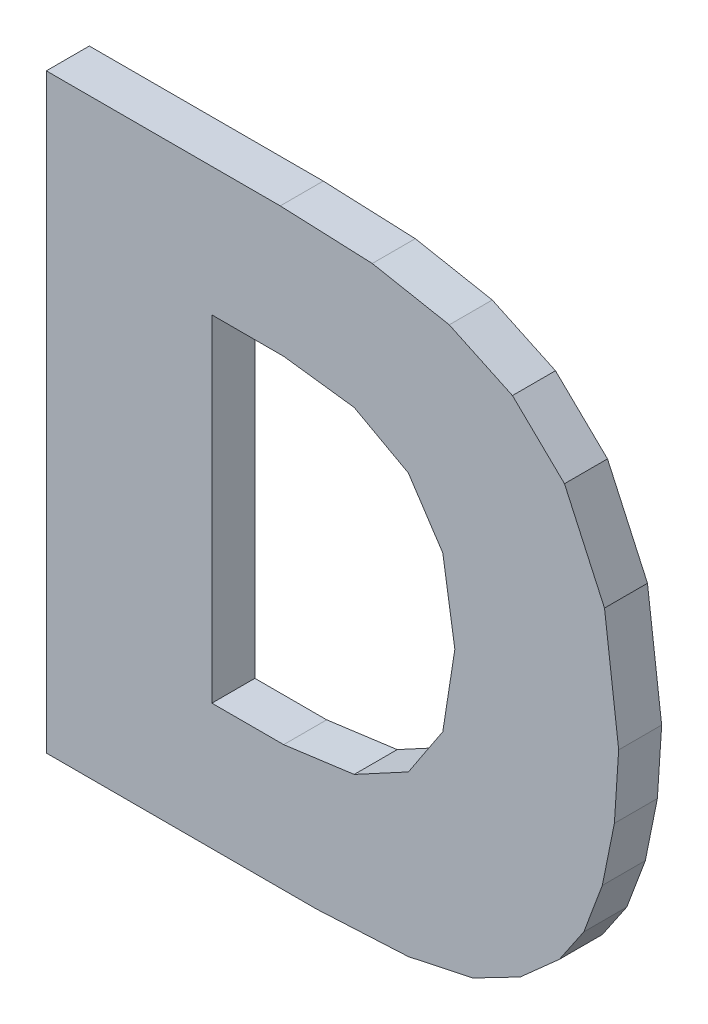
ISO-10303-21;
HEADER;
FILE_DESCRIPTION(('STEP AP214'),'2;1');
FILE_NAME('part.step','',(''),(''),'','','');
FILE_SCHEMA(('AUTOMOTIVE_DESIGN { 1 0 10303 214 1 1 1 1 }'));
ENDSEC;
DATA;
#1=APPLICATION_CONTEXT('core data for automotive mechanical design processes');
#2=APPLICATION_PROTOCOL_DEFINITION('international standard','automotive_design',2000,#1);
#3=PRODUCT_CONTEXT('',#1,'mechanical');
#4=PRODUCT('Part','Part','',(#3));
#5=PRODUCT_RELATED_PRODUCT_CATEGORY('part','',(#4));
#6=PRODUCT_DEFINITION_FORMATION('','',#4);
#7=PRODUCT_DEFINITION_CONTEXT('part definition',#1,'design');
#8=PRODUCT_DEFINITION('design','',#6,#7);
#9=PRODUCT_DEFINITION_SHAPE('','',#8);
#10=(LENGTH_UNIT() NAMED_UNIT(*) SI_UNIT(.MILLI.,.METRE.));
#11=(NAMED_UNIT(*) PLANE_ANGLE_UNIT() SI_UNIT($,.RADIAN.));
#12=(NAMED_UNIT(*) SI_UNIT($,.STERADIAN.) SOLID_ANGLE_UNIT());
#13=UNCERTAINTY_MEASURE_WITH_UNIT(LENGTH_MEASURE(1.E-05),#10,'distance_accuracy_value','');
#14=(GEOMETRIC_REPRESENTATION_CONTEXT(3) GLOBAL_UNCERTAINTY_ASSIGNED_CONTEXT((#13)) GLOBAL_UNIT_ASSIGNED_CONTEXT((#10,
#11,#12)) REPRESENTATION_CONTEXT('',''));
#15=CARTESIAN_POINT('',(0.,0.,0.));
#16=DIRECTION('',(0.,0.,1.));
#17=DIRECTION('',(1.,0.,0.));
#18=AXIS2_PLACEMENT_3D('',#15,#16,#17);
#19=CARTESIAN_POINT('',(0.,0.,0.));
#20=DIRECTION('',(0.,0.,1.));
#21=DIRECTION('',(1.,0.,0.));
#22=AXIS2_PLACEMENT_3D('',#19,#20,#21);
#23=PLANE('',#22);
#24=DIRECTION('',(1.,0.,0.));
#25=VECTOR('',#24,1.);
#26=CARTESIAN_POINT('',(0.311,-1.737,0.));
#27=LINE('',#26,#25);
#28=CARTESIAN_POINT('',(0.311,-1.737,0.));
#29=VERTEX_POINT('',#28);
#30=CARTESIAN_POINT('',(0.477999999999999,-1.737,0.));
#31=VERTEX_POINT('',#30);
#32=EDGE_CURVE('E336',#29,#31,#27,.T.);
#33=ORIENTED_EDGE('',*,*,#32,.F.);
#34=DIRECTION('',(0.,1.,0.));
#35=VECTOR('',#34,1.);
#36=CARTESIAN_POINT('',(0.311,-2.519,0.));
#37=LINE('',#36,#35);
#38=CARTESIAN_POINT('',(0.311,-2.519,0.));
#39=VERTEX_POINT('',#38);
#40=EDGE_CURVE('E331',#39,#29,#37,.T.);
#41=ORIENTED_EDGE('',*,*,#40,.F.);
#42=DIRECTION('',(1.,0.,0.));
#43=VECTOR('',#42,1.);
#44=CARTESIAN_POINT('',(0.478,-2.519,0.));
#45=LINE('',#44,#43);
#46=CARTESIAN_POINT('',(0.478,-2.519,0.));
#47=VERTEX_POINT('',#46);
#48=EDGE_CURVE('E326',#47,#39,#45,.F.);
#49=ORIENTED_EDGE('',*,*,#48,.F.);
#50=DIRECTION('',(-0.99112202245936,-0.132955393256795,0.));
#51=VECTOR('',#50,1.);
#52=CARTESIAN_POINT('',(0.642,-2.497,0.));
#53=LINE('',#52,#51);
#54=CARTESIAN_POINT('',(0.641999999999999,-2.497,0.));
#55=VERTEX_POINT('',#54);
#56=EDGE_CURVE('E321',#55,#47,#53,.T.);
#57=ORIENTED_EDGE('',*,*,#56,.F.);
#58=DIRECTION('',(-0.880022172669681,-0.47493260112329,0.));
#59=VECTOR('',#58,1.);
#60=CARTESIAN_POINT('',(0.768,-2.429,0.));
#61=LINE('',#60,#59);
#62=CARTESIAN_POINT('',(0.768000000000001,-2.429,0.));
#63=VERTEX_POINT('',#62);
#64=EDGE_CURVE('E316',#63,#55,#61,.T.);
#65=ORIENTED_EDGE('',*,*,#64,.F.);
#66=DIRECTION('',(-0.551514326966389,-0.834165419536683,0.));
#67=VECTOR('',#66,1.);
#68=CARTESIAN_POINT('',(0.848,-2.308,0.));
#69=LINE('',#68,#67);
#70=CARTESIAN_POINT('',(0.847999999999998,-2.308,0.));
#71=VERTEX_POINT('',#70);
#72=EDGE_CURVE('E311',#71,#63,#69,.T.);
#73=ORIENTED_EDGE('',*,*,#72,.F.);
#74=DIRECTION('',(-0.153707006281897,-0.988116468954878,0.));
#75=VECTOR('',#74,1.);
#76=CARTESIAN_POINT('',(0.876,-2.128,0.));
#77=LINE('',#76,#75);
#78=CARTESIAN_POINT('',(0.876000000000002,-2.128,0.));
#79=VERTEX_POINT('',#78);
#80=EDGE_CURVE('E306',#79,#71,#77,.T.);
#81=ORIENTED_EDGE('',*,*,#80,.F.);
#82=DIRECTION('',(0.153707006281897,-0.988116468954878,0.));
#83=VECTOR('',#82,1.);
#84=CARTESIAN_POINT('',(0.848,-1.948,0.));
#85=LINE('',#84,#83);
#86=CARTESIAN_POINT('',(0.847999999999999,-1.948,0.));
#87=VERTEX_POINT('',#86);
#88=EDGE_CURVE('E301',#87,#79,#85,.T.);
#89=ORIENTED_EDGE('',*,*,#88,.F.);
#90=DIRECTION('',(0.551514326966389,-0.834165419536683,0.));
#91=VECTOR('',#90,1.);
#92=CARTESIAN_POINT('',(0.768,-1.827,0.));
#93=LINE('',#92,#91);
#94=CARTESIAN_POINT('',(0.768,-1.827,0.));
#95=VERTEX_POINT('',#94);
#96=EDGE_CURVE('E296',#95,#87,#93,.T.);
#97=ORIENTED_EDGE('',*,*,#96,.F.);
#98=DIRECTION('',(0.877096267841495,-0.480314622865597,0.));
#99=VECTOR('',#98,1.);
#100=CARTESIAN_POINT('',(0.642,-1.758,0.));
#101=LINE('',#100,#99);
#102=CARTESIAN_POINT('',(0.642,-1.758,0.));
#103=VERTEX_POINT('',#102);
#104=EDGE_CURVE('E347',#103,#95,#101,.T.);
#105=ORIENTED_EDGE('',*,*,#104,.F.);
#106=DIRECTION('',(0.991901213682567,-0.127011740776396,0.));
#107=VECTOR('',#106,1.);
#108=CARTESIAN_POINT('',(0.478,-1.737,0.));
#109=LINE('',#108,#107);
#110=EDGE_CURVE('E341',#31,#103,#109,.T.);
#111=ORIENTED_EDGE('',*,*,#110,.F.);
#112=EDGE_LOOP('',(#33,#41,#49,#57,#65,#73,#81,#89,#97,#105,#111));
#113=FACE_BOUND('',#112,.T.);
#114=DIRECTION('',(-0.905236944073012,0.424907137013906,0.));
#115=VECTOR('',#114,1.);
#116=CARTESIAN_POINT('',(1.01,-1.55,0.));
#117=LINE('',#116,#115);
#118=CARTESIAN_POINT('',(1.01,-1.55,0.));
#119=VERTEX_POINT('',#118);
#120=CARTESIAN_POINT('',(0.863000000000001,-1.481,0.));
#121=VERTEX_POINT('',#120);
#122=EDGE_CURVE('E283',#119,#121,#117,.T.);
#123=ORIENTED_EDGE('',*,*,#122,.F.);
#124=DIRECTION('',(-0.71888940505698,0.69512446604678,0.));
#125=VECTOR('',#124,1.);
#126=CARTESIAN_POINT('',(1.131,-1.667,0.));
#127=LINE('',#126,#125);
#128=CARTESIAN_POINT('',(1.131,-1.667,0.));
#129=VERTEX_POINT('',#128);
#130=EDGE_CURVE('E278',#129,#119,#127,.T.);
#131=ORIENTED_EDGE('',*,*,#130,.F.);
#132=DIRECTION('',(-0.414810847726089,0.909907665979776,0.));
#133=VECTOR('',#132,1.);
#134=CARTESIAN_POINT('',(1.224,-1.871,0.));
#135=LINE('',#134,#133);
#136=CARTESIAN_POINT('',(1.224,-1.871,0.));
#137=VERTEX_POINT('',#136);
#138=EDGE_CURVE('E273',#137,#129,#135,.T.);
#139=ORIENTED_EDGE('',*,*,#138,.F.);
#140=DIRECTION('',(-0.121763757027801,0.992559110317605,0.));
#141=VECTOR('',#140,1.);
#142=CARTESIAN_POINT('',(1.257,-2.14,0.));
#143=LINE('',#142,#141);
#144=CARTESIAN_POINT('',(1.257,-2.14,0.));
#145=VERTEX_POINT('',#144);
#146=EDGE_CURVE('E268',#145,#137,#143,.T.);
#147=ORIENTED_EDGE('',*,*,#146,.F.);
#148=DIRECTION('',(0.0652203195035123,0.997870888403835,0.));
#149=VECTOR('',#148,1.);
#150=CARTESIAN_POINT('',(1.247,-2.293,0.));
#151=LINE('',#150,#149);
#152=CARTESIAN_POINT('',(1.247,-2.293,0.));
#153=VERTEX_POINT('',#152);
#154=EDGE_CURVE('E263',#153,#145,#151,.T.);
#155=ORIENTED_EDGE('',*,*,#154,.F.);
#156=DIRECTION('',(0.197472212747207,0.980308484709136,0.));
#157=VECTOR('',#156,1.);
#158=CARTESIAN_POINT('',(1.219,-2.432,0.));
#159=LINE('',#158,#157);
#160=CARTESIAN_POINT('',(1.219,-2.432,0.));
#161=VERTEX_POINT('',#160);
#162=EDGE_CURVE('E258',#161,#153,#159,.T.);
#163=ORIENTED_EDGE('',*,*,#162,.F.);
#164=DIRECTION('',(0.350230690288998,0.936663474028795,0.));
#165=VECTOR('',#164,1.);
#166=CARTESIAN_POINT('',(1.176,-2.547,0.));
#167=LINE('',#166,#165);
#168=CARTESIAN_POINT('',(1.176,-2.547,0.));
#169=VERTEX_POINT('',#168);
#170=EDGE_CURVE('E253',#169,#161,#167,.T.);
#171=ORIENTED_EDGE('',*,*,#170,.F.);
#172=DIRECTION('',(0.56150141833727,0.827475774391755,0.));
#173=VECTOR('',#172,1.);
#174=CARTESIAN_POINT('',(1.119,-2.631,0.));
#175=LINE('',#174,#173);
#176=CARTESIAN_POINT('',(1.119,-2.631,0.));
#177=VERTEX_POINT('',#176);
#178=EDGE_CURVE('E248',#177,#169,#175,.T.);
#179=ORIENTED_EDGE('',*,*,#178,.F.);
#180=DIRECTION('',(0.746956272722395,0.664873165829895,0.));
#181=VECTOR('',#180,1.);
#182=CARTESIAN_POINT('',(1.028,-2.712,0.));
#183=LINE('',#182,#181);
#184=CARTESIAN_POINT('',(1.028,-2.712,0.));
#185=VERTEX_POINT('',#184);
#186=EDGE_CURVE('E243',#185,#177,#183,.T.);
#187=ORIENTED_EDGE('',*,*,#186,.F.);
#188=DIRECTION('',(0.887876665033445,0.460081544608223,0.));
#189=VECTOR('',#188,1.);
#190=CARTESIAN_POINT('',(0.918,-2.769,0.));
#191=LINE('',#190,#189);
#192=CARTESIAN_POINT('',(0.918,-2.769,0.));
#193=VERTEX_POINT('',#192);
#194=EDGE_CURVE('E238',#193,#185,#191,.T.);
#195=ORIENTED_EDGE('',*,*,#194,.F.);
#196=DIRECTION('',(0.977992836424311,0.208638471770502,0.));
#197=VECTOR('',#196,1.);
#198=CARTESIAN_POINT('',(0.768,-2.801,0.));
#199=LINE('',#198,#197);
#200=CARTESIAN_POINT('',(0.767999999999999,-2.801,0.));
#201=VERTEX_POINT('',#200);
#202=EDGE_CURVE('E233',#201,#193,#199,.T.);
#203=ORIENTED_EDGE('',*,*,#202,.F.);
#204=DIRECTION('',(0.998669151792375,0.0515744632380987,0.));
#205=VECTOR('',#204,1.);
#206=CARTESIAN_POINT('',(0.555,-2.812,0.));
#207=LINE('',#206,#205);
#208=CARTESIAN_POINT('',(0.555000000000002,-2.812,0.));
#209=VERTEX_POINT('',#208);
#210=EDGE_CURVE('E228',#209,#201,#207,.T.);
#211=ORIENTED_EDGE('',*,*,#210,.F.);
#212=DIRECTION('',(1.,0.,0.));
#213=VECTOR('',#212,1.);
#214=CARTESIAN_POINT('',(-0.074,-2.812,0.));
#215=LINE('',#214,#213);
#216=CARTESIAN_POINT('',(-0.074,-2.812,0.));
#217=VERTEX_POINT('',#216);
#218=EDGE_CURVE('E214',#217,#209,#215,.T.);
#219=ORIENTED_EDGE('',*,*,#218,.F.);
#220=DIRECTION('',(0.,1.,0.));
#221=VECTOR('',#220,1.);
#222=CARTESIAN_POINT('',(-0.074,-1.438,0.));
#223=LINE('',#222,#221);
#224=CARTESIAN_POINT('',(-0.074,-1.438,0.));
#225=VERTEX_POINT('',#224);
#226=EDGE_CURVE('E199',#225,#217,#223,.F.);
#227=ORIENTED_EDGE('',*,*,#226,.F.);
#228=DIRECTION('',(1.,0.,0.));
#229=VECTOR('',#228,1.);
#230=CARTESIAN_POINT('',(0.47,-1.438,0.));
#231=LINE('',#230,#229);
#232=CARTESIAN_POINT('',(0.469999999999997,-1.438,0.));
#233=VERTEX_POINT('',#232);
#234=EDGE_CURVE('E20',#233,#225,#231,.F.);
#235=ORIENTED_EDGE('',*,*,#234,.F.);
#236=DIRECTION('',(-0.999116814691378,0.0420189314589891,0.));
#237=VECTOR('',#236,1.);
#238=CARTESIAN_POINT('',(0.684,-1.447,0.));
#239=LINE('',#238,#237);
#240=CARTESIAN_POINT('',(0.684,-1.447,0.));
#241=VERTEX_POINT('',#240);
#242=EDGE_CURVE('E294',#241,#233,#239,.T.);
#243=ORIENTED_EDGE('',*,*,#242,.F.);
#244=DIRECTION('',(-0.98243451501208,0.186607673242496,0.));
#245=VECTOR('',#244,1.);
#246=CARTESIAN_POINT('',(0.863,-1.481,0.));
#247=LINE('',#246,#245);
#248=EDGE_CURVE('E288',#121,#241,#247,.T.);
#249=ORIENTED_EDGE('',*,*,#248,.F.);
#250=EDGE_LOOP('',(#123,#131,#139,#147,#155,#163,#171,#179,#187,#195,#203,#211,#219,#227,#235,
#243,#249));
#251=FACE_BOUND('',#250,.T.);
#252=ADVANCED_FACE('F17',(#113,#251),#23,.F.);
#253=CARTESIAN_POINT('',(0.47,-1.438,0.));
#254=DIRECTION('',(0.,1.,0.));
#255=DIRECTION('',(0.,0.,1.));
#256=AXIS2_PLACEMENT_3D('',#253,#254,#255);
#257=PLANE('',#256);
#258=DIRECTION('',(0.,0.,1.));
#259=VECTOR('',#258,1.);
#260=CARTESIAN_POINT('',(0.47,-1.438,0.));
#261=LINE('',#260,#259);
#262=CARTESIAN_POINT('',(0.469999999999977,-1.438,0.1));
#263=VERTEX_POINT('',#262);
#264=EDGE_CURVE('E208',#233,#263,#261,.T.);
#265=ORIENTED_EDGE('',*,*,#264,.F.);
#266=ORIENTED_EDGE('',*,*,#234,.T.);
#267=DIRECTION('',(0.,0.,1.));
#268=VECTOR('',#267,1.);
#269=CARTESIAN_POINT('',(-0.074,-1.438,0.));
#270=LINE('',#269,#268);
#271=CARTESIAN_POINT('',(-0.074,-1.438,0.1));
#272=VERTEX_POINT('',#271);
#273=EDGE_CURVE('E205',#272,#225,#270,.F.);
#274=ORIENTED_EDGE('',*,*,#273,.F.);
#275=DIRECTION('',(1.,0.,0.));
#276=VECTOR('',#275,1.);
#277=CARTESIAN_POINT('',(0.,-1.438,0.1));
#278=LINE('',#277,#276);
#279=EDGE_CURVE('E350',#263,#272,#278,.F.);
#280=ORIENTED_EDGE('',*,*,#279,.F.);
#281=EDGE_LOOP('',(#265,#266,#274,#280));
#282=FACE_BOUND('',#281,.T.);
#283=ADVANCED_FACE('F204',(#282),#257,.T.);
#284=CARTESIAN_POINT('',(-0.074,-1.438,0.));
#285=DIRECTION('',(-1.,0.,0.));
#286=DIRECTION('',(0.,0.,1.));
#287=AXIS2_PLACEMENT_3D('',#284,#285,#286);
#288=PLANE('',#287);
#289=ORIENTED_EDGE('',*,*,#273,.T.);
#290=ORIENTED_EDGE('',*,*,#226,.T.);
#291=DIRECTION('',(0.,0.,-1.));
#292=VECTOR('',#291,1.);
#293=CARTESIAN_POINT('',(-0.074,-2.812,0.));
#294=LINE('',#293,#292);
#295=CARTESIAN_POINT('',(-0.074,-2.812,0.1));
#296=VERTEX_POINT('',#295);
#297=EDGE_CURVE('E216',#296,#217,#294,.T.);
#298=ORIENTED_EDGE('',*,*,#297,.F.);
#299=DIRECTION('',(0.,1.,0.));
#300=VECTOR('',#299,1.);
#301=CARTESIAN_POINT('',(-0.074,0.,0.1));
#302=LINE('',#301,#300);
#303=EDGE_CURVE('E220',#272,#296,#302,.F.);
#304=ORIENTED_EDGE('',*,*,#303,.F.);
#305=EDGE_LOOP('',(#289,#290,#298,#304));
#306=FACE_BOUND('',#305,.T.);
#307=ADVANCED_FACE('F218',(#306),#288,.T.);
#308=CARTESIAN_POINT('',(-0.074,-2.812,0.));
#309=DIRECTION('',(0.,-1.,0.));
#310=DIRECTION('',(0.,0.,-1.));
#311=AXIS2_PLACEMENT_3D('',#308,#309,#310);
#312=PLANE('',#311);
#313=ORIENTED_EDGE('',*,*,#297,.T.);
#314=ORIENTED_EDGE('',*,*,#218,.T.);
#315=DIRECTION('',(0.,0.,1.));
#316=VECTOR('',#315,1.);
#317=CARTESIAN_POINT('',(0.555,-2.812,0.));
#318=LINE('',#317,#316);
#319=CARTESIAN_POINT('',(0.555000000000002,-2.812,0.1));
#320=VERTEX_POINT('',#319);
#321=EDGE_CURVE('E225',#320,#209,#318,.F.);
#322=ORIENTED_EDGE('',*,*,#321,.F.);
#323=DIRECTION('',(1.,0.,0.));
#324=VECTOR('',#323,1.);
#325=CARTESIAN_POINT('',(0.,-2.812,0.1));
#326=LINE('',#325,#324);
#327=EDGE_CURVE('E353',#296,#320,#326,.T.);
#328=ORIENTED_EDGE('',*,*,#327,.F.);
#329=EDGE_LOOP('',(#313,#314,#322,#328));
#330=FACE_BOUND('',#329,.T.);
#331=ADVANCED_FACE('F691',(#330),#312,.T.);
#332=CARTESIAN_POINT('',(0.555,-2.812,0.));
#333=DIRECTION('',(0.0515744632380987,-0.998669151792375,0.));
#334=DIRECTION('',(0.998669151792375,0.0515744632380987,0.));
#335=AXIS2_PLACEMENT_3D('',#332,#333,#334);
#336=PLANE('',#335);
#337=ORIENTED_EDGE('',*,*,#321,.T.);
#338=ORIENTED_EDGE('',*,*,#210,.T.);
#339=DIRECTION('',(0.,0.,1.));
#340=VECTOR('',#339,1.);
#341=CARTESIAN_POINT('',(0.768,-2.801,0.));
#342=LINE('',#341,#340);
#343=CARTESIAN_POINT('',(0.767999999999999,-2.801,0.1));
#344=VERTEX_POINT('',#343);
#345=EDGE_CURVE('E230',#344,#201,#342,.F.);
#346=ORIENTED_EDGE('',*,*,#345,.F.);
#347=DIRECTION('',(0.998669151792375,0.0515744632381026,0.));
#348=VECTOR('',#347,1.);
#349=CARTESIAN_POINT('',(0.555,-2.812,0.1));
#350=LINE('',#349,#348);
#351=EDGE_CURVE('E356',#320,#344,#350,.T.);
#352=ORIENTED_EDGE('',*,*,#351,.F.);
#353=EDGE_LOOP('',(#337,#338,#346,#352));
#354=FACE_BOUND('',#353,.T.);
#355=ADVANCED_FACE('F682',(#354),#336,.T.);
#356=CARTESIAN_POINT('',(0.768,-2.801,0.));
#357=DIRECTION('',(0.208638471770502,-0.977992836424311,0.));
#358=DIRECTION('',(0.977992836424311,0.208638471770502,0.));
#359=AXIS2_PLACEMENT_3D('',#356,#357,#358);
#360=PLANE('',#359);
#361=ORIENTED_EDGE('',*,*,#345,.T.);
#362=ORIENTED_EDGE('',*,*,#202,.T.);
#363=DIRECTION('',(0.,0.,1.));
#364=VECTOR('',#363,1.);
#365=CARTESIAN_POINT('',(0.918,-2.769,0.));
#366=LINE('',#365,#364);
#367=CARTESIAN_POINT('',(0.918,-2.769,0.1));
#368=VERTEX_POINT('',#367);
#369=EDGE_CURVE('E235',#368,#193,#366,.F.);
#370=ORIENTED_EDGE('',*,*,#369,.F.);
#371=DIRECTION('',(0.977992836424308,0.208638471770518,0.));
#372=VECTOR('',#371,1.);
#373=CARTESIAN_POINT('',(0.768,-2.801,0.1));
#374=LINE('',#373,#372);
#375=EDGE_CURVE('E359',#344,#368,#374,.T.);
#376=ORIENTED_EDGE('',*,*,#375,.F.);
#377=EDGE_LOOP('',(#361,#362,#370,#376));
#378=FACE_BOUND('',#377,.T.);
#379=ADVANCED_FACE('F673',(#378),#360,.T.);
#380=CARTESIAN_POINT('',(0.918,-2.769,0.));
#381=DIRECTION('',(0.460081544608223,-0.887876665033445,0.));
#382=DIRECTION('',(0.887876665033445,0.460081544608223,0.));
#383=AXIS2_PLACEMENT_3D('',#380,#381,#382);
#384=PLANE('',#383);
#385=ORIENTED_EDGE('',*,*,#369,.T.);
#386=ORIENTED_EDGE('',*,*,#194,.T.);
#387=DIRECTION('',(0.,0.,1.));
#388=VECTOR('',#387,1.);
#389=CARTESIAN_POINT('',(1.028,-2.712,0.));
#390=LINE('',#389,#388);
#391=CARTESIAN_POINT('',(1.028,-2.712,0.1));
#392=VERTEX_POINT('',#391);
#393=EDGE_CURVE('E240',#392,#185,#390,.F.);
#394=ORIENTED_EDGE('',*,*,#393,.F.);
#395=DIRECTION('',(0.887876665033439,0.460081544608235,0.));
#396=VECTOR('',#395,1.);
#397=CARTESIAN_POINT('',(0.918,-2.769,0.1));
#398=LINE('',#397,#396);
#399=EDGE_CURVE('E362',#368,#392,#398,.T.);
#400=ORIENTED_EDGE('',*,*,#399,.F.);
#401=EDGE_LOOP('',(#385,#386,#394,#400));
#402=FACE_BOUND('',#401,.T.);
#403=ADVANCED_FACE('F664',(#402),#384,.T.);
#404=CARTESIAN_POINT('',(1.028,-2.712,0.));
#405=DIRECTION('',(0.664873165829895,-0.746956272722395,0.));
#406=DIRECTION('',(0.746956272722395,0.664873165829895,0.));
#407=AXIS2_PLACEMENT_3D('',#404,#405,#406);
#408=PLANE('',#407);
#409=ORIENTED_EDGE('',*,*,#393,.T.);
#410=ORIENTED_EDGE('',*,*,#186,.T.);
#411=DIRECTION('',(0.,0.,1.));
#412=VECTOR('',#411,1.);
#413=CARTESIAN_POINT('',(1.119,-2.631,0.));
#414=LINE('',#413,#412);
#415=CARTESIAN_POINT('',(1.119,-2.631,0.1));
#416=VERTEX_POINT('',#415);
#417=EDGE_CURVE('E245',#416,#177,#414,.F.);
#418=ORIENTED_EDGE('',*,*,#417,.F.);
#419=DIRECTION('',(0.746956272722427,0.664873165829859,0.));
#420=VECTOR('',#419,1.);
#421=CARTESIAN_POINT('',(1.028,-2.712,0.1));
#422=LINE('',#421,#420);
#423=EDGE_CURVE('E365',#392,#416,#422,.T.);
#424=ORIENTED_EDGE('',*,*,#423,.F.);
#425=EDGE_LOOP('',(#409,#410,#418,#424));
#426=FACE_BOUND('',#425,.T.);
#427=ADVANCED_FACE('F655',(#426),#408,.T.);
#428=CARTESIAN_POINT('',(1.119,-2.631,0.));
#429=DIRECTION('',(0.827475774391755,-0.56150141833727,0.));
#430=DIRECTION('',(0.56150141833727,0.827475774391755,0.));
#431=AXIS2_PLACEMENT_3D('',#428,#429,#430);
#432=PLANE('',#431);
#433=ORIENTED_EDGE('',*,*,#417,.T.);
#434=ORIENTED_EDGE('',*,*,#178,.T.);
#435=DIRECTION('',(0.,0.,1.));
#436=VECTOR('',#435,1.);
#437=CARTESIAN_POINT('',(1.176,-2.547,0.));
#438=LINE('',#437,#436);
#439=CARTESIAN_POINT('',(1.176,-2.547,0.1));
#440=VERTEX_POINT('',#439);
#441=EDGE_CURVE('E250',#440,#169,#438,.F.);
#442=ORIENTED_EDGE('',*,*,#441,.F.);
#443=DIRECTION('',(0.561501418337267,0.827475774391757,0.));
#444=VECTOR('',#443,1.);
#445=CARTESIAN_POINT('',(1.119,-2.631,0.1));
#446=LINE('',#445,#444);
#447=EDGE_CURVE('E368',#416,#440,#446,.T.);
#448=ORIENTED_EDGE('',*,*,#447,.F.);
#449=EDGE_LOOP('',(#433,#434,#442,#448));
#450=FACE_BOUND('',#449,.T.);
#451=ADVANCED_FACE('F646',(#450),#432,.T.);
#452=CARTESIAN_POINT('',(1.176,-2.547,0.));
#453=DIRECTION('',(0.936663474028795,-0.350230690288998,0.));
#454=DIRECTION('',(0.350230690288998,0.936663474028795,0.));
#455=AXIS2_PLACEMENT_3D('',#452,#453,#454);
#456=PLANE('',#455);
#457=ORIENTED_EDGE('',*,*,#441,.T.);
#458=ORIENTED_EDGE('',*,*,#170,.T.);
#459=DIRECTION('',(0.,0.,1.));
#460=VECTOR('',#459,1.);
#461=CARTESIAN_POINT('',(1.219,-2.432,0.));
#462=LINE('',#461,#460);
#463=CARTESIAN_POINT('',(1.219,-2.432,0.1));
#464=VERTEX_POINT('',#463);
#465=EDGE_CURVE('E255',#464,#161,#462,.F.);
#466=ORIENTED_EDGE('',*,*,#465,.F.);
#467=DIRECTION('',(0.350230690289024,0.936663474028786,0.));
#468=VECTOR('',#467,1.);
#469=CARTESIAN_POINT('',(1.176,-2.547,0.1));
#470=LINE('',#469,#468);
#471=EDGE_CURVE('E371',#440,#464,#470,.T.);
#472=ORIENTED_EDGE('',*,*,#471,.F.);
#473=EDGE_LOOP('',(#457,#458,#466,#472));
#474=FACE_BOUND('',#473,.T.);
#475=ADVANCED_FACE('F637',(#474),#456,.T.);
#476=CARTESIAN_POINT('',(1.219,-2.432,0.));
#477=DIRECTION('',(0.980308484709136,-0.197472212747207,0.));
#478=DIRECTION('',(0.197472212747207,0.980308484709136,0.));
#479=AXIS2_PLACEMENT_3D('',#476,#477,#478);
#480=PLANE('',#479);
#481=ORIENTED_EDGE('',*,*,#465,.T.);
#482=ORIENTED_EDGE('',*,*,#162,.T.);
#483=DIRECTION('',(0.,0.,1.));
#484=VECTOR('',#483,1.);
#485=CARTESIAN_POINT('',(1.247,-2.293,0.));
#486=LINE('',#485,#484);
#487=CARTESIAN_POINT('',(1.247,-2.293,0.1));
#488=VERTEX_POINT('',#487);
#489=EDGE_CURVE('E260',#488,#153,#486,.F.);
#490=ORIENTED_EDGE('',*,*,#489,.F.);
#491=DIRECTION('',(0.197472212747166,0.980308484709144,0.));
#492=VECTOR('',#491,1.);
#493=CARTESIAN_POINT('',(1.219,-2.432,0.1));
#494=LINE('',#493,#492);
#495=EDGE_CURVE('E374',#464,#488,#494,.T.);
#496=ORIENTED_EDGE('',*,*,#495,.F.);
#497=EDGE_LOOP('',(#481,#482,#490,#496));
#498=FACE_BOUND('',#497,.T.);
#499=ADVANCED_FACE('F628',(#498),#480,.T.);
#500=CARTESIAN_POINT('',(1.247,-2.293,0.));
#501=DIRECTION('',(0.997870888403835,-0.0652203195035123,0.));
#502=DIRECTION('',(0.0652203195035123,0.997870888403835,0.));
#503=AXIS2_PLACEMENT_3D('',#500,#501,#502);
#504=PLANE('',#503);
#505=ORIENTED_EDGE('',*,*,#489,.T.);
#506=ORIENTED_EDGE('',*,*,#154,.T.);
#507=DIRECTION('',(0.,0.,1.));
#508=VECTOR('',#507,1.);
#509=CARTESIAN_POINT('',(1.257,-2.14,0.));
#510=LINE('',#509,#508);
#511=CARTESIAN_POINT('',(1.257,-2.14,0.1));
#512=VERTEX_POINT('',#511);
#513=EDGE_CURVE('E265',#512,#145,#510,.F.);
#514=ORIENTED_EDGE('',*,*,#513,.F.);
#515=DIRECTION('',(0.0652203195035172,0.997870888403835,0.));
#516=VECTOR('',#515,1.);
#517=CARTESIAN_POINT('',(1.247,-2.293,0.1));
#518=LINE('',#517,#516);
#519=EDGE_CURVE('E377',#488,#512,#518,.T.);
#520=ORIENTED_EDGE('',*,*,#519,.F.);
#521=EDGE_LOOP('',(#505,#506,#514,#520));
#522=FACE_BOUND('',#521,.T.);
#523=ADVANCED_FACE('F619',(#522),#504,.T.);
#524=CARTESIAN_POINT('',(1.257,-2.14,0.));
#525=DIRECTION('',(0.992559110317605,0.121763757027801,0.));
#526=DIRECTION('',(-0.121763757027801,0.992559110317605,0.));
#527=AXIS2_PLACEMENT_3D('',#524,#525,#526);
#528=PLANE('',#527);
#529=ORIENTED_EDGE('',*,*,#513,.T.);
#530=ORIENTED_EDGE('',*,*,#146,.T.);
#531=DIRECTION('',(0.,0.,1.));
#532=VECTOR('',#531,1.);
#533=CARTESIAN_POINT('',(1.224,-1.871,0.));
#534=LINE('',#533,#532);
#535=CARTESIAN_POINT('',(1.224,-1.871,0.1));
#536=VERTEX_POINT('',#535);
#537=EDGE_CURVE('E270',#536,#137,#534,.F.);
#538=ORIENTED_EDGE('',*,*,#537,.F.);
#539=DIRECTION('',(-0.121763757027809,0.992559110317603,0.));
#540=VECTOR('',#539,1.);
#541=CARTESIAN_POINT('',(1.257,-2.14,0.1));
#542=LINE('',#541,#540);
#543=EDGE_CURVE('E380',#512,#536,#542,.T.);
#544=ORIENTED_EDGE('',*,*,#543,.F.);
#545=EDGE_LOOP('',(#529,#530,#538,#544));
#546=FACE_BOUND('',#545,.T.);
#547=ADVANCED_FACE('F610',(#546),#528,.T.);
#548=CARTESIAN_POINT('',(1.224,-1.871,0.));
#549=DIRECTION('',(0.909907665979776,0.414810847726089,0.));
#550=DIRECTION('',(-0.414810847726089,0.909907665979776,0.));
#551=AXIS2_PLACEMENT_3D('',#548,#549,#550);
#552=PLANE('',#551);
#553=ORIENTED_EDGE('',*,*,#537,.T.);
#554=ORIENTED_EDGE('',*,*,#138,.T.);
#555=DIRECTION('',(0.,0.,1.));
#556=VECTOR('',#555,1.);
#557=CARTESIAN_POINT('',(1.131,-1.667,0.));
#558=LINE('',#557,#556);
#559=CARTESIAN_POINT('',(1.131,-1.667,0.1));
#560=VERTEX_POINT('',#559);
#561=EDGE_CURVE('E275',#560,#129,#558,.F.);
#562=ORIENTED_EDGE('',*,*,#561,.F.);
#563=DIRECTION('',(-0.414810847726077,0.909907665979781,0.));
#564=VECTOR('',#563,1.);
#565=CARTESIAN_POINT('',(1.224,-1.871,0.1));
#566=LINE('',#565,#564);
#567=EDGE_CURVE('E383',#536,#560,#566,.T.);
#568=ORIENTED_EDGE('',*,*,#567,.F.);
#569=EDGE_LOOP('',(#553,#554,#562,#568));
#570=FACE_BOUND('',#569,.T.);
#571=ADVANCED_FACE('F601',(#570),#552,.T.);
#572=CARTESIAN_POINT('',(1.131,-1.667,0.));
#573=DIRECTION('',(0.69512446604678,0.71888940505698,0.));
#574=DIRECTION('',(-0.71888940505698,0.69512446604678,0.));
#575=AXIS2_PLACEMENT_3D('',#572,#573,#574);
#576=PLANE('',#575);
#577=ORIENTED_EDGE('',*,*,#561,.T.);
#578=ORIENTED_EDGE('',*,*,#130,.T.);
#579=DIRECTION('',(0.,0.,1.));
#580=VECTOR('',#579,1.);
#581=CARTESIAN_POINT('',(1.01,-1.55,0.));
#582=LINE('',#581,#580);
#583=CARTESIAN_POINT('',(1.01,-1.55,0.1));
#584=VERTEX_POINT('',#583);
#585=EDGE_CURVE('E280',#584,#119,#582,.F.);
#586=ORIENTED_EDGE('',*,*,#585,.F.);
#587=DIRECTION('',(-0.718889405056954,0.695124466046807,0.));
#588=VECTOR('',#587,1.);
#589=CARTESIAN_POINT('',(1.131,-1.667,0.1));
#590=LINE('',#589,#588);
#591=EDGE_CURVE('E386',#560,#584,#590,.T.);
#592=ORIENTED_EDGE('',*,*,#591,.F.);
#593=EDGE_LOOP('',(#577,#578,#586,#592));
#594=FACE_BOUND('',#593,.T.);
#595=ADVANCED_FACE('F592',(#594),#576,.T.);
#596=CARTESIAN_POINT('',(1.01,-1.55,0.));
#597=DIRECTION('',(0.424907137013906,0.905236944073012,0.));
#598=DIRECTION('',(-0.905236944073012,0.424907137013906,0.));
#599=AXIS2_PLACEMENT_3D('',#596,#597,#598);
#600=PLANE('',#599);
#601=ORIENTED_EDGE('',*,*,#585,.T.);
#602=ORIENTED_EDGE('',*,*,#122,.T.);
#603=DIRECTION('',(0.,0.,1.));
#604=VECTOR('',#603,1.);
#605=CARTESIAN_POINT('',(0.863,-1.481,0.));
#606=LINE('',#605,#604);
#607=CARTESIAN_POINT('',(0.863000000000001,-1.481,0.1));
#608=VERTEX_POINT('',#607);
#609=EDGE_CURVE('E285',#608,#121,#606,.F.);
#610=ORIENTED_EDGE('',*,*,#609,.F.);
#611=DIRECTION('',(-0.905236944073029,0.424907137013871,0.));
#612=VECTOR('',#611,1.);
#613=CARTESIAN_POINT('',(1.01,-1.55,0.1));
#614=LINE('',#613,#612);
#615=EDGE_CURVE('E389',#584,#608,#614,.T.);
#616=ORIENTED_EDGE('',*,*,#615,.F.);
#617=EDGE_LOOP('',(#601,#602,#610,#616));
#618=FACE_BOUND('',#617,.T.);
#619=ADVANCED_FACE('F583',(#618),#600,.T.);
#620=CARTESIAN_POINT('',(0.863,-1.481,0.));
#621=DIRECTION('',(0.186607673242496,0.98243451501208,0.));
#622=DIRECTION('',(-0.98243451501208,0.186607673242496,0.));
#623=AXIS2_PLACEMENT_3D('',#620,#621,#622);
#624=PLANE('',#623);
#625=ORIENTED_EDGE('',*,*,#609,.T.);
#626=ORIENTED_EDGE('',*,*,#248,.T.);
#627=DIRECTION('',(0.,0.,1.));
#628=VECTOR('',#627,1.);
#629=CARTESIAN_POINT('',(0.684,-1.447,0.));
#630=LINE('',#629,#628);
#631=CARTESIAN_POINT('',(0.684,-1.447,0.1));
#632=VERTEX_POINT('',#631);
#633=EDGE_CURVE('E291',#632,#241,#630,.F.);
#634=ORIENTED_EDGE('',*,*,#633,.F.);
#635=DIRECTION('',(-0.982434515012076,0.186607673242517,0.));
#636=VECTOR('',#635,1.);
#637=CARTESIAN_POINT('',(0.863,-1.481,0.1));
#638=LINE('',#637,#636);
#639=EDGE_CURVE('E392',#608,#632,#638,.T.);
#640=ORIENTED_EDGE('',*,*,#639,.F.);
#641=EDGE_LOOP('',(#625,#626,#634,#640));
#642=FACE_BOUND('',#641,.T.);
#643=ADVANCED_FACE('F574',(#642),#624,.T.);
#644=CARTESIAN_POINT('',(0.684,-1.447,0.));
#645=DIRECTION('',(0.0420189314589891,0.999116814691378,0.));
#646=DIRECTION('',(-0.999116814691378,0.0420189314589891,0.));
#647=AXIS2_PLACEMENT_3D('',#644,#645,#646);
#648=PLANE('',#647);
#649=ORIENTED_EDGE('',*,*,#633,.T.);
#650=ORIENTED_EDGE('',*,*,#242,.T.);
#651=ORIENTED_EDGE('',*,*,#264,.T.);
#652=DIRECTION('',(-0.999116814691378,0.0420189314589837,0.));
#653=VECTOR('',#652,1.);
#654=CARTESIAN_POINT('',(0.684,-1.447,0.1));
#655=LINE('',#654,#653);
#656=EDGE_CURVE('E395',#632,#263,#655,.T.);
#657=ORIENTED_EDGE('',*,*,#656,.F.);
#658=EDGE_LOOP('',(#649,#650,#651,#657));
#659=FACE_BOUND('',#658,.T.);
#660=ADVANCED_FACE('F566',(#659),#648,.T.);
#661=CARTESIAN_POINT('',(0.768,-1.827,0.));
#662=DIRECTION('',(-0.834165419536683,-0.551514326966389,0.));
#663=DIRECTION('',(0.551514326966389,-0.834165419536683,0.));
#664=AXIS2_PLACEMENT_3D('',#661,#662,#663);
#665=PLANE('',#664);
#666=DIRECTION('',(0.,0.,1.));
#667=VECTOR('',#666,1.);
#668=CARTESIAN_POINT('',(0.767999999999999,-1.827,0.));
#669=LINE('',#668,#667);
#670=CARTESIAN_POINT('',(0.768,-1.827,0.1));
#671=VERTEX_POINT('',#670);
#672=EDGE_CURVE('E343',#95,#671,#669,.T.);
#673=ORIENTED_EDGE('',*,*,#672,.F.);
#674=ORIENTED_EDGE('',*,*,#96,.T.);
#675=DIRECTION('',(0.,0.,1.));
#676=VECTOR('',#675,1.);
#677=CARTESIAN_POINT('',(0.848,-1.948,0.));
#678=LINE('',#677,#676);
#679=CARTESIAN_POINT('',(0.847999999999999,-1.948,0.1));
#680=VERTEX_POINT('',#679);
#681=EDGE_CURVE('E298',#680,#87,#678,.F.);
#682=ORIENTED_EDGE('',*,*,#681,.F.);
#683=DIRECTION('',(0.551514326966398,-0.834165419536677,0.));
#684=VECTOR('',#683,1.);
#685=CARTESIAN_POINT('',(0.768,-1.827,0.1));
#686=LINE('',#685,#684);
#687=EDGE_CURVE('E398',#671,#680,#686,.T.);
#688=ORIENTED_EDGE('',*,*,#687,.F.);
#689=EDGE_LOOP('',(#673,#674,#682,#688));
#690=FACE_BOUND('',#689,.T.);
#691=ADVANCED_FACE('F443',(#690),#665,.T.);
#692=CARTESIAN_POINT('',(0.848,-1.948,0.));
#693=DIRECTION('',(-0.988116468954878,-0.153707006281897,0.));
#694=DIRECTION('',(0.153707006281897,-0.988116468954878,0.));
#695=AXIS2_PLACEMENT_3D('',#692,#693,#694);
#696=PLANE('',#695);
#697=ORIENTED_EDGE('',*,*,#681,.T.);
#698=ORIENTED_EDGE('',*,*,#88,.T.);
#699=DIRECTION('',(0.,0.,1.));
#700=VECTOR('',#699,1.);
#701=CARTESIAN_POINT('',(0.876,-2.128,0.));
#702=LINE('',#701,#700);
#703=CARTESIAN_POINT('',(0.876000000000002,-2.128,0.1));
#704=VERTEX_POINT('',#703);
#705=EDGE_CURVE('E303',#704,#79,#702,.F.);
#706=ORIENTED_EDGE('',*,*,#705,.F.);
#707=DIRECTION('',(0.153707006281871,-0.988116468954882,0.));
#708=VECTOR('',#707,1.);
#709=CARTESIAN_POINT('',(0.848,-1.948,0.1));
#710=LINE('',#709,#708);
#711=EDGE_CURVE('E401',#680,#704,#710,.T.);
#712=ORIENTED_EDGE('',*,*,#711,.F.);
#713=EDGE_LOOP('',(#697,#698,#706,#712));
#714=FACE_BOUND('',#713,.T.);
#715=ADVANCED_FACE('F447',(#714),#696,.T.);
#716=CARTESIAN_POINT('',(0.876,-2.128,0.));
#717=DIRECTION('',(-0.988116468954878,0.153707006281897,0.));
#718=DIRECTION('',(-0.153707006281897,-0.988116468954878,0.));
#719=AXIS2_PLACEMENT_3D('',#716,#717,#718);
#720=PLANE('',#719);
#721=ORIENTED_EDGE('',*,*,#705,.T.);
#722=ORIENTED_EDGE('',*,*,#80,.T.);
#723=DIRECTION('',(0.,0.,1.));
#724=VECTOR('',#723,1.);
#725=CARTESIAN_POINT('',(0.848,-2.308,0.));
#726=LINE('',#725,#724);
#727=CARTESIAN_POINT('',(0.847999999999998,-2.308,0.1));
#728=VERTEX_POINT('',#727);
#729=EDGE_CURVE('E308',#728,#71,#726,.F.);
#730=ORIENTED_EDGE('',*,*,#729,.F.);
#731=DIRECTION('',(-0.153707006281871,-0.988116468954882,0.));
#732=VECTOR('',#731,1.);
#733=CARTESIAN_POINT('',(0.876,-2.128,0.1));
#734=LINE('',#733,#732);
#735=EDGE_CURVE('E404',#704,#728,#734,.T.);
#736=ORIENTED_EDGE('',*,*,#735,.F.);
#737=EDGE_LOOP('',(#721,#722,#730,#736));
#738=FACE_BOUND('',#737,.T.);
#739=ADVANCED_FACE('F450',(#738),#720,.T.);
#740=CARTESIAN_POINT('',(0.848,-2.308,0.));
#741=DIRECTION('',(-0.834165419536683,0.551514326966389,0.));
#742=DIRECTION('',(-0.551514326966389,-0.834165419536683,0.));
#743=AXIS2_PLACEMENT_3D('',#740,#741,#742);
#744=PLANE('',#743);
#745=ORIENTED_EDGE('',*,*,#729,.T.);
#746=ORIENTED_EDGE('',*,*,#72,.T.);
#747=DIRECTION('',(0.,0.,1.));
#748=VECTOR('',#747,1.);
#749=CARTESIAN_POINT('',(0.768,-2.429,0.));
#750=LINE('',#749,#748);
#751=CARTESIAN_POINT('',(0.768000000000001,-2.429,0.1));
#752=VERTEX_POINT('',#751);
#753=EDGE_CURVE('E313',#752,#63,#750,.F.);
#754=ORIENTED_EDGE('',*,*,#753,.F.);
#755=DIRECTION('',(-0.551514326966398,-0.834165419536677,0.));
#756=VECTOR('',#755,1.);
#757=CARTESIAN_POINT('',(0.848,-2.308,0.1));
#758=LINE('',#757,#756);
#759=EDGE_CURVE('E407',#728,#752,#758,.T.);
#760=ORIENTED_EDGE('',*,*,#759,.F.);
#761=EDGE_LOOP('',(#745,#746,#754,#760));
#762=FACE_BOUND('',#761,.T.);
#763=ADVANCED_FACE('F454',(#762),#744,.T.);
#764=CARTESIAN_POINT('',(0.768,-2.429,0.));
#765=DIRECTION('',(-0.47493260112329,0.880022172669681,0.));
#766=DIRECTION('',(-0.880022172669681,-0.47493260112329,0.));
#767=AXIS2_PLACEMENT_3D('',#764,#765,#766);
#768=PLANE('',#767);
#769=ORIENTED_EDGE('',*,*,#753,.T.);
#770=ORIENTED_EDGE('',*,*,#64,.T.);
#771=DIRECTION('',(0.,0.,1.));
#772=VECTOR('',#771,1.);
#773=CARTESIAN_POINT('',(0.642,-2.497,0.));
#774=LINE('',#773,#772);
#775=CARTESIAN_POINT('',(0.641999999999999,-2.497,0.1));
#776=VERTEX_POINT('',#775);
#777=EDGE_CURVE('E318',#776,#55,#774,.F.);
#778=ORIENTED_EDGE('',*,*,#777,.F.);
#779=DIRECTION('',(-0.880022172669668,-0.474932601123315,0.));
#780=VECTOR('',#779,1.);
#781=CARTESIAN_POINT('',(0.768,-2.429,0.1));
#782=LINE('',#781,#780);
#783=EDGE_CURVE('E410',#752,#776,#782,.T.);
#784=ORIENTED_EDGE('',*,*,#783,.F.);
#785=EDGE_LOOP('',(#769,#770,#778,#784));
#786=FACE_BOUND('',#785,.T.);
#787=ADVANCED_FACE('F458',(#786),#768,.T.);
#788=CARTESIAN_POINT('',(0.642,-2.497,0.));
#789=DIRECTION('',(-0.132955393256795,0.99112202245936,0.));
#790=DIRECTION('',(-0.99112202245936,-0.132955393256795,0.));
#791=AXIS2_PLACEMENT_3D('',#788,#789,#790);
#792=PLANE('',#791);
#793=ORIENTED_EDGE('',*,*,#777,.T.);
#794=ORIENTED_EDGE('',*,*,#56,.T.);
#795=DIRECTION('',(0.,0.,1.));
#796=VECTOR('',#795,1.);
#797=CARTESIAN_POINT('',(0.478,-2.519,0.));
#798=LINE('',#797,#796);
#799=CARTESIAN_POINT('',(0.478,-2.519,0.1));
#800=VERTEX_POINT('',#799);
#801=EDGE_CURVE('E323',#800,#47,#798,.F.);
#802=ORIENTED_EDGE('',*,*,#801,.F.);
#803=DIRECTION('',(-0.991122022459366,-0.132955393256744,0.));
#804=VECTOR('',#803,1.);
#805=CARTESIAN_POINT('',(0.642,-2.497,0.1));
#806=LINE('',#805,#804);
#807=EDGE_CURVE('E413',#776,#800,#806,.T.);
#808=ORIENTED_EDGE('',*,*,#807,.F.);
#809=EDGE_LOOP('',(#793,#794,#802,#808));
#810=FACE_BOUND('',#809,.T.);
#811=ADVANCED_FACE('F462',(#810),#792,.T.);
#812=CARTESIAN_POINT('',(0.478,-2.519,0.));
#813=DIRECTION('',(0.,1.,0.));
#814=DIRECTION('',(0.,0.,1.));
#815=AXIS2_PLACEMENT_3D('',#812,#813,#814);
#816=PLANE('',#815);
#817=ORIENTED_EDGE('',*,*,#801,.T.);
#818=ORIENTED_EDGE('',*,*,#48,.T.);
#819=DIRECTION('',(0.,0.,-1.));
#820=VECTOR('',#819,1.);
#821=CARTESIAN_POINT('',(0.311,-2.519,0.));
#822=LINE('',#821,#820);
#823=CARTESIAN_POINT('',(0.311,-2.519,0.1));
#824=VERTEX_POINT('',#823);
#825=EDGE_CURVE('E328',#824,#39,#822,.T.);
#826=ORIENTED_EDGE('',*,*,#825,.F.);
#827=DIRECTION('',(1.,0.,0.));
#828=VECTOR('',#827,1.);
#829=CARTESIAN_POINT('',(0.,-2.519,0.1));
#830=LINE('',#829,#828);
#831=EDGE_CURVE('E416',#800,#824,#830,.F.);
#832=ORIENTED_EDGE('',*,*,#831,.F.);
#833=EDGE_LOOP('',(#817,#818,#826,#832));
#834=FACE_BOUND('',#833,.T.);
#835=ADVANCED_FACE('F466',(#834),#816,.T.);
#836=CARTESIAN_POINT('',(0.311,-2.519,0.));
#837=DIRECTION('',(1.,0.,0.));
#838=DIRECTION('',(0.,0.,-1.));
#839=AXIS2_PLACEMENT_3D('',#836,#837,#838);
#840=PLANE('',#839);
#841=ORIENTED_EDGE('',*,*,#825,.T.);
#842=ORIENTED_EDGE('',*,*,#40,.T.);
#843=DIRECTION('',(0.,0.,-1.));
#844=VECTOR('',#843,1.);
#845=CARTESIAN_POINT('',(0.311,-1.737,0.));
#846=LINE('',#845,#844);
#847=CARTESIAN_POINT('',(0.311,-1.737,0.1));
#848=VERTEX_POINT('',#847);
#849=EDGE_CURVE('E333',#848,#29,#846,.T.);
#850=ORIENTED_EDGE('',*,*,#849,.F.);
#851=DIRECTION('',(0.,1.,0.));
#852=VECTOR('',#851,1.);
#853=CARTESIAN_POINT('',(0.311,0.,0.1));
#854=LINE('',#853,#852);
#855=EDGE_CURVE('E419',#824,#848,#854,.T.);
#856=ORIENTED_EDGE('',*,*,#855,.F.);
#857=EDGE_LOOP('',(#841,#842,#850,#856));
#858=FACE_BOUND('',#857,.T.);
#859=ADVANCED_FACE('F469',(#858),#840,.T.);
#860=CARTESIAN_POINT('',(0.311,-1.737,0.));
#861=DIRECTION('',(0.,-1.,0.));
#862=DIRECTION('',(0.,0.,-1.));
#863=AXIS2_PLACEMENT_3D('',#860,#861,#862);
#864=PLANE('',#863);
#865=ORIENTED_EDGE('',*,*,#849,.T.);
#866=ORIENTED_EDGE('',*,*,#32,.T.);
#867=DIRECTION('',(0.,0.,1.));
#868=VECTOR('',#867,1.);
#869=CARTESIAN_POINT('',(0.478,-1.737,0.));
#870=LINE('',#869,#868);
#871=CARTESIAN_POINT('',(0.477999999999999,-1.737,0.1));
#872=VERTEX_POINT('',#871);
#873=EDGE_CURVE('E338',#872,#31,#870,.F.);
#874=ORIENTED_EDGE('',*,*,#873,.F.);
#875=DIRECTION('',(1.,0.,0.));
#876=VECTOR('',#875,1.);
#877=CARTESIAN_POINT('',(0.,-1.737,0.1));
#878=LINE('',#877,#876);
#879=EDGE_CURVE('E422',#848,#872,#878,.T.);
#880=ORIENTED_EDGE('',*,*,#879,.F.);
#881=EDGE_LOOP('',(#865,#866,#874,#880));
#882=FACE_BOUND('',#881,.T.);
#883=ADVANCED_FACE('F434',(#882),#864,.T.);
#884=CARTESIAN_POINT('',(0.478,-1.737,0.));
#885=DIRECTION('',(-0.127011740776396,-0.991901213682567,0.));
#886=DIRECTION('',(0.991901213682567,-0.127011740776396,0.));
#887=AXIS2_PLACEMENT_3D('',#884,#885,#886);
#888=PLANE('',#887);
#889=ORIENTED_EDGE('',*,*,#873,.T.);
#890=ORIENTED_EDGE('',*,*,#110,.T.);
#891=DIRECTION('',(0.,0.,1.));
#892=VECTOR('',#891,1.);
#893=CARTESIAN_POINT('',(0.642,-1.758,0.));
#894=LINE('',#893,#892);
#895=CARTESIAN_POINT('',(0.642,-1.758,0.1));
#896=VERTEX_POINT('',#895);
#897=EDGE_CURVE('E35',#896,#103,#894,.F.);
#898=ORIENTED_EDGE('',*,*,#897,.F.);
#899=DIRECTION('',(0.991901213682563,-0.127011740776426,0.));
#900=VECTOR('',#899,1.);
#901=CARTESIAN_POINT('',(0.478,-1.737,0.1));
#902=LINE('',#901,#900);
#903=EDGE_CURVE('E26',#872,#896,#902,.T.);
#904=ORIENTED_EDGE('',*,*,#903,.F.);
#905=EDGE_LOOP('',(#889,#890,#898,#904));
#906=FACE_BOUND('',#905,.T.);
#907=ADVANCED_FACE('F430',(#906),#888,.T.);
#908=CARTESIAN_POINT('',(0.642,-1.758,0.));
#909=DIRECTION('',(-0.480314622865597,-0.877096267841495,0.));
#910=DIRECTION('',(0.877096267841495,-0.480314622865597,0.));
#911=AXIS2_PLACEMENT_3D('',#908,#909,#910);
#912=PLANE('',#911);
#913=ORIENTED_EDGE('',*,*,#897,.T.);
#914=ORIENTED_EDGE('',*,*,#104,.T.);
#915=ORIENTED_EDGE('',*,*,#672,.T.);
#916=DIRECTION('',(0.877096267841502,-0.480314622865585,0.));
#917=VECTOR('',#916,1.);
#918=CARTESIAN_POINT('',(0.642,-1.758,0.1));
#919=LINE('',#918,#917);
#920=EDGE_CURVE('E11',#896,#671,#919,.T.);
#921=ORIENTED_EDGE('',*,*,#920,.F.);
#922=EDGE_LOOP('',(#913,#914,#915,#921));
#923=FACE_BOUND('',#922,.T.);
#924=ADVANCED_FACE('F441',(#923),#912,.T.);
#925=CARTESIAN_POINT('',(0.,0.,0.1));
#926=DIRECTION('',(0.,0.,1.));
#927=DIRECTION('',(1.,0.,0.));
#928=AXIS2_PLACEMENT_3D('',#925,#926,#927);
#929=PLANE('',#928);
#930=ORIENTED_EDGE('',*,*,#903,.T.);
#931=ORIENTED_EDGE('',*,*,#920,.T.);
#932=ORIENTED_EDGE('',*,*,#687,.T.);
#933=ORIENTED_EDGE('',*,*,#711,.T.);
#934=ORIENTED_EDGE('',*,*,#735,.T.);
#935=ORIENTED_EDGE('',*,*,#759,.T.);
#936=ORIENTED_EDGE('',*,*,#783,.T.);
#937=ORIENTED_EDGE('',*,*,#807,.T.);
#938=ORIENTED_EDGE('',*,*,#831,.T.);
#939=ORIENTED_EDGE('',*,*,#855,.T.);
#940=ORIENTED_EDGE('',*,*,#879,.T.);
#941=EDGE_LOOP('',(#930,#931,#932,#933,#934,#935,#936,#937,#938,#939,#940));
#942=FACE_BOUND('',#941,.T.);
#943=ORIENTED_EDGE('',*,*,#639,.T.);
#944=ORIENTED_EDGE('',*,*,#656,.T.);
#945=ORIENTED_EDGE('',*,*,#279,.T.);
#946=ORIENTED_EDGE('',*,*,#303,.T.);
#947=ORIENTED_EDGE('',*,*,#327,.T.);
#948=ORIENTED_EDGE('',*,*,#351,.T.);
#949=ORIENTED_EDGE('',*,*,#375,.T.);
#950=ORIENTED_EDGE('',*,*,#399,.T.);
#951=ORIENTED_EDGE('',*,*,#423,.T.);
#952=ORIENTED_EDGE('',*,*,#447,.T.);
#953=ORIENTED_EDGE('',*,*,#471,.T.);
#954=ORIENTED_EDGE('',*,*,#495,.T.);
#955=ORIENTED_EDGE('',*,*,#519,.T.);
#956=ORIENTED_EDGE('',*,*,#543,.T.);
#957=ORIENTED_EDGE('',*,*,#567,.T.);
#958=ORIENTED_EDGE('',*,*,#591,.T.);
#959=ORIENTED_EDGE('',*,*,#615,.T.);
#960=EDGE_LOOP('',(#943,#944,#945,#946,#947,#948,#949,#950,#951,#952,#953,#954,#955,#956,#957,
#958,#959));
#961=FACE_BOUND('',#960,.T.);
#962=ADVANCED_FACE('F427',(#942,#961),#929,.T.);
#963=CLOSED_SHELL('',(#252,#283,#307,#331,#355,#379,#403,#427,#451,#475,#499,#523,#547,#571,
#595,#619,#643,#660,#691,#715,#739,#763,#787,#811,#835,#859,#883,#907,#924,#962));
#964=MANIFOLD_SOLID_BREP('B1',#963);
#965=ADVANCED_BREP_SHAPE_REPRESENTATION('',(#18,#964),#14);
#966=SHAPE_DEFINITION_REPRESENTATION(#9,#965);
ENDSEC;
END-ISO-10303-21;
